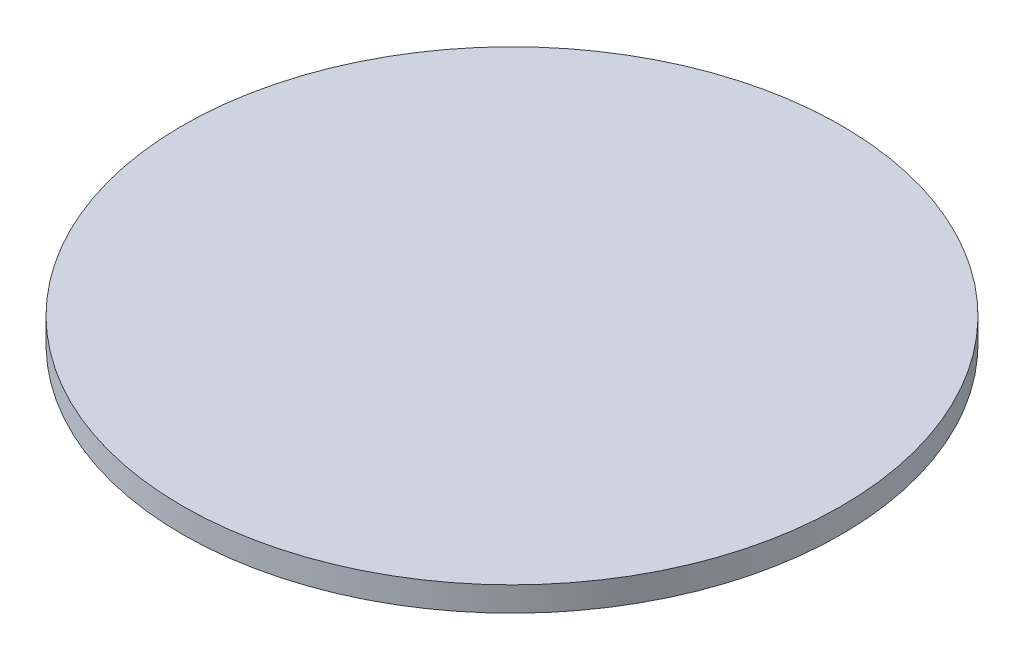
ISO-10303-21;
HEADER;
FILE_DESCRIPTION(('STEP AP214'),'2;1');
FILE_NAME('part.step','',(''),(''),'','','');
FILE_SCHEMA(('AUTOMOTIVE_DESIGN { 1 0 10303 214 1 1 1 1 }'));
ENDSEC;
DATA;
#1=APPLICATION_CONTEXT('core data for automotive mechanical design processes');
#2=APPLICATION_PROTOCOL_DEFINITION('international standard','automotive_design',2000,#1);
#3=PRODUCT_CONTEXT('',#1,'mechanical');
#4=PRODUCT('Part','Part','',(#3));
#5=PRODUCT_RELATED_PRODUCT_CATEGORY('part','',(#4));
#6=PRODUCT_DEFINITION_FORMATION('','',#4);
#7=PRODUCT_DEFINITION_CONTEXT('part definition',#1,'design');
#8=PRODUCT_DEFINITION('design','',#6,#7);
#9=PRODUCT_DEFINITION_SHAPE('','',#8);
#10=(LENGTH_UNIT() NAMED_UNIT(*) SI_UNIT(.MILLI.,.METRE.));
#11=(NAMED_UNIT(*) PLANE_ANGLE_UNIT() SI_UNIT($,.RADIAN.));
#12=(NAMED_UNIT(*) SI_UNIT($,.STERADIAN.) SOLID_ANGLE_UNIT());
#13=UNCERTAINTY_MEASURE_WITH_UNIT(LENGTH_MEASURE(1.E-05),#10,'distance_accuracy_value','');
#14=(GEOMETRIC_REPRESENTATION_CONTEXT(3) GLOBAL_UNCERTAINTY_ASSIGNED_CONTEXT((#13)) GLOBAL_UNIT_ASSIGNED_CONTEXT((#10,
#11,#12)) REPRESENTATION_CONTEXT('',''));
#15=CARTESIAN_POINT('',(0.,0.,0.));
#16=DIRECTION('',(0.,0.,1.));
#17=DIRECTION('',(1.,0.,0.));
#18=AXIS2_PLACEMENT_3D('',#15,#16,#17);
#19=CARTESIAN_POINT('',(103.,-4.90687617358795,114.707106781187));
#20=CARTESIAN_POINT('',(104.68251224703,-4.90687617358795,114.707106781187));
#21=CARTESIAN_POINT('',(108.04753674109,-4.90687617358795,114.375680796435));
#22=CARTESIAN_POINT('',(112.90109947591,-4.90687617358795,112.903368637147));
#23=CARTESIAN_POINT('',(117.374168510472,-4.90687617358795,110.512463426297));
#24=CARTESIAN_POINT('',(121.294846310303,-4.90687617358795,107.294846310303));
#25=CARTESIAN_POINT('',(124.512463426297,-4.90687617358796,103.374168510472));
#26=CARTESIAN_POINT('',(126.903368637147,-4.90687617358795,98.9010994759102));
#27=CARTESIAN_POINT('',(128.375680796435,-4.90687617358795,94.0475367410895));
#28=CARTESIAN_POINT('',(128.872819773562,-4.90687617358795,89.));
#29=CARTESIAN_POINT('',(128.375680796435,-4.90687617358796,83.9524632589106));
#30=CARTESIAN_POINT('',(126.903368637147,-4.90687617358795,79.0989005240899));
#31=CARTESIAN_POINT('',(124.512463426297,-4.90687617358795,74.6258314895279));
#32=CARTESIAN_POINT('',(121.294846310303,-4.90687617358796,70.7051536896968));
#33=CARTESIAN_POINT('',(117.374168510472,-4.90687617358795,67.4875365737027));
#34=CARTESIAN_POINT('',(112.90109947591,-4.90687617358795,65.0966313628527));
#35=CARTESIAN_POINT('',(108.04753674109,-4.90687617358796,63.6243192035646));
#36=CARTESIAN_POINT('',(103.,-4.90687617358795,63.1271802264379));
#37=CARTESIAN_POINT('',(97.9524632589106,-4.90687617358795,63.6243192035646));
#38=CARTESIAN_POINT('',(93.09890052409,-4.90687617358795,65.0966313628526));
#39=CARTESIAN_POINT('',(88.625831489528,-4.90687617358795,67.4875365737027));
#40=CARTESIAN_POINT('',(84.7051536896969,-4.90687617358796,70.7051536896968));
#41=CARTESIAN_POINT('',(81.4875365737028,-4.90687617358795,74.6258314895279));
#42=CARTESIAN_POINT('',(79.0966313628527,-4.90687617358795,79.0989005240899));
#43=CARTESIAN_POINT('',(77.6243192035647,-4.90687617358795,83.9524632589105));
#44=CARTESIAN_POINT('',(77.1271802264379,-4.90687617358796,89.));
#45=CARTESIAN_POINT('',(77.6243192035647,-4.90687617358795,94.0475367410896));
#46=CARTESIAN_POINT('',(79.0966313628527,-4.90687617358795,98.9010994759101));
#47=CARTESIAN_POINT('',(81.4875365737027,-4.90687617358795,103.374168510472));
#48=CARTESIAN_POINT('',(84.7051536896969,-4.90687617358796,107.294846310303));
#49=CARTESIAN_POINT('',(88.625831489528,-4.90687617358795,110.512463426297));
#50=CARTESIAN_POINT('',(93.09890052409,-4.90687617358795,112.903368637147));
#51=CARTESIAN_POINT('',(97.9524632589106,-4.90687617358795,114.375680796435));
#52=CARTESIAN_POINT('',(101.31748775297,-4.90687617358795,114.707106781187));
#53=CARTESIAN_POINT('',(103.,-4.90687617358795,114.707106781187));
#54=B_SPLINE_CURVE_WITH_KNOTS('',3,(#19,#20,#21,#22,#23,#24,#25,#26,#27,#28,#29,#30,#31,#32,#33,
#34,#35,#36,#37,#38,#39,#40,#41,#42,#43,#44,#45,#46,#47,#48,#49,#50,#51,#52,#53),.UNSPECIFIED.,
.T.,.F.,(4,1,1,1,1,1,1,1,1,1,1,1,1,1,1,1,1,1,1,1,1,1,1,1,1,1,1,1,1,1,1,1,4),(0.,0.03125,
0.0625000000000001,0.09375,0.125,0.15625,0.1875,0.21875,0.25,0.28125,0.3125,0.34375,0.375,
0.40625,0.4375,0.46875,0.5,0.53125,0.5625,0.59375,0.625,0.65625,0.6875,0.71875,0.75,0.78125,
0.8125,0.84375,0.875,0.90625,0.9375,0.96875,1.),.UNSPECIFIED.);
#55=DIRECTION('',(0.,1.,0.));
#56=VECTOR('',#55,1.);
#57=SURFACE_OF_LINEAR_EXTRUSION('',#54,#56);
#58=CARTESIAN_POINT('',(103.,-4.90687617358795,114.707106781187));
#59=CARTESIAN_POINT('',(104.68251224703,-4.90687617358795,114.707106781187));
#60=CARTESIAN_POINT('',(108.04753674109,-4.90687617358796,114.375680796435));
#61=CARTESIAN_POINT('',(112.90109947591,-4.90687617358796,112.903368637147));
#62=CARTESIAN_POINT('',(117.374168510472,-4.90687617358796,110.512463426297));
#63=CARTESIAN_POINT('',(121.294846310303,-4.90687617358796,107.294846310303));
#64=CARTESIAN_POINT('',(124.512463426297,-4.90687617358796,103.374168510472));
#65=CARTESIAN_POINT('',(126.903368637147,-4.90687617358795,98.9010994759102));
#66=CARTESIAN_POINT('',(128.375680796435,-4.90687617358795,94.0475367410895));
#67=CARTESIAN_POINT('',(128.872819773562,-4.90687617358795,89.));
#68=CARTESIAN_POINT('',(128.375680796435,-4.90687617358796,83.9524632589106));
#69=CARTESIAN_POINT('',(126.903368637147,-4.90687617358796,79.0989005240899));
#70=CARTESIAN_POINT('',(124.512463426297,-4.90687617358796,74.6258314895279));
#71=CARTESIAN_POINT('',(121.294846310303,-4.90687617358796,70.7051536896968));
#72=CARTESIAN_POINT('',(117.374168510472,-4.90687617358796,67.4875365737027));
#73=CARTESIAN_POINT('',(112.90109947591,-4.90687617358795,65.0966313628527));
#74=CARTESIAN_POINT('',(108.04753674109,-4.90687617358796,63.6243192035646));
#75=CARTESIAN_POINT('',(103.,-4.90687617358796,63.1271802264379));
#76=CARTESIAN_POINT('',(97.9524632589106,-4.90687617358795,63.6243192035646));
#77=CARTESIAN_POINT('',(93.09890052409,-4.90687617358795,65.0966313628526));
#78=CARTESIAN_POINT('',(88.625831489528,-4.90687617358796,67.4875365737027));
#79=CARTESIAN_POINT('',(84.7051536896969,-4.90687617358796,70.7051536896968));
#80=CARTESIAN_POINT('',(81.4875365737028,-4.90687617358795,74.6258314895279));
#81=CARTESIAN_POINT('',(79.0966313628527,-4.90687617358796,79.0989005240899));
#82=CARTESIAN_POINT('',(77.6243192035647,-4.90687617358795,83.9524632589105));
#83=CARTESIAN_POINT('',(77.1271802264379,-4.90687617358796,89.));
#84=CARTESIAN_POINT('',(77.6243192035647,-4.90687617358796,94.0475367410896));
#85=CARTESIAN_POINT('',(79.0966313628527,-4.90687617358795,98.9010994759101));
#86=CARTESIAN_POINT('',(81.4875365737027,-4.90687617358796,103.374168510472));
#87=CARTESIAN_POINT('',(84.7051536896969,-4.90687617358796,107.294846310303));
#88=CARTESIAN_POINT('',(88.625831489528,-4.90687617358795,110.512463426297));
#89=CARTESIAN_POINT('',(93.09890052409,-4.90687617358796,112.903368637147));
#90=CARTESIAN_POINT('',(97.9524632589106,-4.90687617358796,114.375680796435));
#91=CARTESIAN_POINT('',(101.31748775297,-4.90687617358795,114.707106781187));
#92=CARTESIAN_POINT('',(103.,-4.90687617358795,114.707106781187));
#93=B_SPLINE_CURVE_WITH_KNOTS('',3,(#58,#59,#60,#61,#62,#63,#64,#65,#66,#67,#68,#69,#70,#71,#72,
#73,#74,#75,#76,#77,#78,#79,#80,#81,#82,#83,#84,#85,#86,#87,#88,#89,#90,#91,#92),.UNSPECIFIED.,
.T.,.F.,(4,1,1,1,1,1,1,1,1,1,1,1,1,1,1,1,1,1,1,1,1,1,1,1,1,1,1,1,1,1,1,1,4),(0.,0.03125,
0.0625000000000001,0.09375,0.125,0.15625,0.1875,0.21875,0.25,0.28125,0.3125,0.34375,0.375,
0.40625,0.4375,0.46875,0.5,0.53125,0.5625,0.59375,0.625,0.65625,0.6875,0.71875,0.75,0.78125,
0.8125,0.84375,0.875,0.90625,0.9375,0.96875,1.),.UNSPECIFIED.);
#94=CARTESIAN_POINT('',(103.,-4.90687617358795,114.707106781187));
#95=VERTEX_POINT('',#94);
#96=EDGE_CURVE('E9',#95,#95,#93,.T.);
#97=ORIENTED_EDGE('',*,*,#96,.T.);
#98=EDGE_LOOP('',(#97));
#99=FACE_BOUND('',#98,.T.);
#100=CARTESIAN_POINT('',(103.,-2.98931512157521,114.707106781187));
#101=CARTESIAN_POINT('',(102.579369355434,-2.98931512157521,114.707106693939));
#102=CARTESIAN_POINT('',(102.158741772165,-2.98931512157521,114.696749595474));
#103=CARTESIAN_POINT('',(101.318496875122,-2.98931512157521,114.655420938262));
#104=CARTESIAN_POINT('',(100.898879569222,-2.98931512157521,114.624449219384));
#105=CARTESIAN_POINT('',(100.061665939949,-2.98931512157521,114.541990886596));
#106=CARTESIAN_POINT('',(99.6440696165763,-2.98931512157521,114.490504272685));
#107=CARTESIAN_POINT('',(98.8119060984851,-2.98931512157521,114.367115028231));
#108=CARTESIAN_POINT('',(98.3973388802626,-2.98931512157521,114.295212556279));
#109=CARTESIAN_POINT('',(97.5722456396482,-2.98931512157521,114.131091309205));
#110=CARTESIAN_POINT('',(97.1617196172563,-2.98931512157521,114.038872534082));
#111=CARTESIAN_POINT('',(96.3456816963751,-2.98931512157521,113.834414117491));
#112=CARTESIAN_POINT('',(95.9401698368598,-2.98931512157521,113.722174320509));
#113=CARTESIAN_POINT('',(95.1351301005794,-2.98931512157521,113.477968186669));
#114=CARTESIAN_POINT('',(94.7356022238144,-2.98931512157521,113.34600184981));
#115=CARTESIAN_POINT('',(93.9435004761241,-2.98931512157521,113.062636429833));
#116=CARTESIAN_POINT('',(93.5509265512054,-2.98931512157521,112.911237497673));
#117=CARTESIAN_POINT('',(92.773705730394,-2.98931512157521,112.589302092768));
#118=CARTESIAN_POINT('',(92.3890588345014,-2.98931512157521,112.418765620024));
#119=CARTESIAN_POINT('',(91.6285887070654,-2.98931512157521,112.059034712628));
#120=CARTESIAN_POINT('',(91.2527655440864,-2.98931512157521,111.869840133053));
#121=CARTESIAN_POINT('',(90.510836675156,-2.98931512157521,111.473270890529));
#122=CARTESIAN_POINT('',(90.1447309692046,-2.98931512157521,111.265896227581));
#123=CARTESIAN_POINT('',(89.4231310851812,-2.98931512157521,110.83344420958));
#124=CARTESIAN_POINT('',(89.0676368247028,-2.98931512157521,110.608366992052));
#125=CARTESIAN_POINT('',(88.3681565659301,-2.98931512157521,110.140989225494));
#126=CARTESIAN_POINT('',(88.0241705676357,-2.98931512157521,109.898688676465));
#127=CARTESIAN_POINT('',(87.3484926789989,-2.98931512157521,109.397509535533));
#128=CARTESIAN_POINT('',(87.0168008841765,-2.98931512157521,109.138630814869));
#129=CARTESIAN_POINT('',(86.3664947916554,-2.98931512157521,108.60493839719));
#130=CARTESIAN_POINT('',(86.0478804939568,-2.98931512157521,108.330124700176));
#131=CARTESIAN_POINT('',(85.4245131528125,-2.98931512157521,107.765204972699));
#132=CARTESIAN_POINT('',(85.1197600017141,-2.98931512157521,107.475099061041));
#133=CARTESIAN_POINT('',(84.5249009389586,-2.98931512157521,106.880239998286));
#134=CARTESIAN_POINT('',(84.2347950273014,-2.98931512157521,106.575486847188));
#135=CARTESIAN_POINT('',(83.6698752998245,-2.98931512157521,105.952119506043));
#136=CARTESIAN_POINT('',(83.3950616028096,-2.98931512157521,105.633505208345));
#137=CARTESIAN_POINT('',(82.8613691851309,-2.98931512157521,104.983199115824));
#138=CARTESIAN_POINT('',(82.6024904644672,-2.98931512157521,104.651507321001));
#139=CARTESIAN_POINT('',(82.1013113235354,-2.98931512157521,103.975829432364));
#140=CARTESIAN_POINT('',(81.8590107745057,-2.98931512157521,103.63184343407));
#141=CARTESIAN_POINT('',(81.3916330079478,-2.98931512157521,102.932363175297));
#142=CARTESIAN_POINT('',(81.1665557904197,-2.98931512157521,102.57686891482));
#143=CARTESIAN_POINT('',(80.7341037724191,-2.98931512157521,101.855269030795));
#144=CARTESIAN_POINT('',(80.5267291094706,-2.98931512157521,101.489163324841));
#145=CARTESIAN_POINT('',(80.1301598669476,-2.98931512157521,100.747234455917));
#146=CARTESIAN_POINT('',(79.9409652873729,-2.98931512157521,100.371411292947));
#147=CARTESIAN_POINT('',(79.5812343799753,-2.98931512157521,99.6109411654861));
#148=CARTESIAN_POINT('',(79.4106979072297,-2.98931512157521,99.2262942695591));
#149=CARTESIAN_POINT('',(79.0887625023298,-2.98931512157521,98.4490734488416));
#150=CARTESIAN_POINT('',(78.9373635701755,-2.98931512157521,98.0564995240512));
#151=CARTESIAN_POINT('',(78.6539981501812,-2.98931512157521,97.2643977760104));
#152=CARTESIAN_POINT('',(78.5220318132992,-2.98931512157521,96.8648698987665));
#153=CARTESIAN_POINT('',(78.2778256795233,-2.98931512157521,96.0598301637945));
#154=CARTESIAN_POINT('',(78.1655858826293,-2.98931512157521,95.6543183060663));
#155=CARTESIAN_POINT('',(77.9611274657977,-2.98931512157521,94.8382803803026));
#156=CARTESIAN_POINT('',(77.8689086903458,-2.98931512157521,94.4277543512412));
#157=CARTESIAN_POINT('',(77.7047874441707,-2.98931512157521,93.6026611288483));
#158=CARTESIAN_POINT('',(77.6328849734476,-2.98931512157521,93.1880939355168));
#159=CARTESIAN_POINT('',(77.5094957256366,-2.98931512157521,92.3559303494217));
#160=CARTESIAN_POINT('',(77.45800910714,-2.98931512157521,91.9383339331527));
#161=CARTESIAN_POINT('',(77.3755507868799,-2.98931512157521,91.1011205576757));
#162=CARTESIAN_POINT('',(77.3445790851164,-2.98931512157521,90.6815035984678));
#163=CARTESIAN_POINT('',(77.303250381148,-2.98931512157521,89.8412577542494));
#164=CARTESIAN_POINT('',(77.2928932188135,-2.98931512157521,89.4206288771247));
#165=CARTESIAN_POINT('',(77.2928932188135,-2.98931512157521,88.5793711228753));
#166=CARTESIAN_POINT('',(77.303250381148,-2.98931512157521,88.1587422457506));
#167=CARTESIAN_POINT('',(77.3445790851164,-2.98931512157521,87.3184964015322));
#168=CARTESIAN_POINT('',(77.3755507868799,-2.98931512157521,86.8988794423244));
#169=CARTESIAN_POINT('',(77.45800910714,-2.98931512157521,86.0616660668474));
#170=CARTESIAN_POINT('',(77.5094957256366,-2.98931512157521,85.6440696505783));
#171=CARTESIAN_POINT('',(77.6328849734475,-2.98931512157521,84.8119060644832));
#172=CARTESIAN_POINT('',(77.7047874441707,-2.98931512157521,84.3973388711518));
#173=CARTESIAN_POINT('',(77.8689086903458,-2.98931512157521,83.5722456487589));
#174=CARTESIAN_POINT('',(77.9611274657977,-2.98931512157521,83.1617196196974));
#175=CARTESIAN_POINT('',(78.1655858826293,-2.98931512157521,82.3456816939338));
#176=CARTESIAN_POINT('',(78.2778256795233,-2.98931512157521,81.9401698362056));
#177=CARTESIAN_POINT('',(78.5220318132992,-2.98931512157521,81.1351301012335));
#178=CARTESIAN_POINT('',(78.6539981501811,-2.98931512157521,80.7356022239896));
#179=CARTESIAN_POINT('',(78.9373635701755,-2.98931512157521,79.9435004759488));
#180=CARTESIAN_POINT('',(79.0887625023298,-2.98931512157521,79.5509265511584));
#181=CARTESIAN_POINT('',(79.4106979072297,-2.98931512157521,78.7737057304409));
#182=CARTESIAN_POINT('',(79.5812343799753,-2.98931512157521,78.3890588345139));
#183=CARTESIAN_POINT('',(79.9409652873729,-2.98931512157521,77.6285887070527));
#184=CARTESIAN_POINT('',(80.1301598669476,-2.98931512157521,77.252765544083));
#185=CARTESIAN_POINT('',(80.5267291094706,-2.98931512157521,76.5108366751594));
#186=CARTESIAN_POINT('',(80.734103772419,-2.98931512157521,76.1447309692054));
#187=CARTESIAN_POINT('',(81.1665557904196,-2.98931512157521,75.4231310851802));
#188=CARTESIAN_POINT('',(81.3916330079478,-2.98931512157521,75.0676368247025));
#189=CARTESIAN_POINT('',(81.8590107745057,-2.98931512157521,74.3681565659303));
#190=CARTESIAN_POINT('',(82.1013113235354,-2.98931512157521,74.0241705676357));
#191=CARTESIAN_POINT('',(82.6024904644672,-2.98931512157521,73.3484926789988));
#192=CARTESIAN_POINT('',(82.8613691851309,-2.98931512157521,73.0168008841764));
#193=CARTESIAN_POINT('',(83.3950616028096,-2.98931512157521,72.3664947916554));
#194=CARTESIAN_POINT('',(83.6698752998245,-2.98931512157521,72.0478804939567));
#195=CARTESIAN_POINT('',(84.2347950273014,-2.98931512157521,71.4245131528124));
#196=CARTESIAN_POINT('',(84.5249009389586,-2.98931512157521,71.1197600017141));
#197=CARTESIAN_POINT('',(85.1197600017141,-2.98931512157521,70.5249009389586));
#198=CARTESIAN_POINT('',(85.4245131528124,-2.98931512157521,70.2347950273013));
#199=CARTESIAN_POINT('',(86.0478804939568,-2.98931512157521,69.6698752998244));
#200=CARTESIAN_POINT('',(86.3664947916554,-2.98931512157521,69.3950616028095));
#201=CARTESIAN_POINT('',(87.0168008841764,-2.98931512157521,68.8613691851309));
#202=CARTESIAN_POINT('',(87.3484926789988,-2.98931512157521,68.6024904644671));
#203=CARTESIAN_POINT('',(88.0241705676357,-2.98931512157521,68.1013113235354));
#204=CARTESIAN_POINT('',(88.3681565659303,-2.98931512157521,67.8590107745056));
#205=CARTESIAN_POINT('',(89.0676368247026,-2.98931512157521,67.3916330079477));
#206=CARTESIAN_POINT('',(89.4231310851803,-2.98931512157521,67.1665557904196));
#207=CARTESIAN_POINT('',(90.1447309692055,-2.98931512157521,66.734103772419));
#208=CARTESIAN_POINT('',(90.5108366751594,-2.98931512157521,66.5267291094706));
#209=CARTESIAN_POINT('',(91.2527655440831,-2.98931512157521,66.1301598669475));
#210=CARTESIAN_POINT('',(91.6285887070528,-2.98931512157521,65.9409652873729));
#211=CARTESIAN_POINT('',(92.389058834514,-2.98931512157521,65.5812343799752));
#212=CARTESIAN_POINT('',(92.773705730441,-2.98931512157521,65.4106979072296));
#213=CARTESIAN_POINT('',(93.5509265511584,-2.98931512157521,65.0887625023297));
#214=CARTESIAN_POINT('',(93.9435004759489,-2.98931512157521,64.9373635701754));
#215=CARTESIAN_POINT('',(94.7356022239897,-2.98931512157521,64.6539981501811));
#216=CARTESIAN_POINT('',(95.1351301012335,-2.98931512157521,64.5220318132992));
#217=CARTESIAN_POINT('',(95.9401698362056,-2.98931512157521,64.2778256795233));
#218=CARTESIAN_POINT('',(96.3456816939338,-2.98931512157521,64.1655858826292));
#219=CARTESIAN_POINT('',(97.1617196196975,-2.98931512157521,63.9611274657976));
#220=CARTESIAN_POINT('',(97.572245648759,-2.98931512157521,63.8689086903457));
#221=CARTESIAN_POINT('',(98.3973388711519,-2.98931512157521,63.7047874441706));
#222=CARTESIAN_POINT('',(98.8119060644833,-2.98931512157521,63.6328849734474));
#223=CARTESIAN_POINT('',(99.6440696505784,-2.98931512157521,63.5094957256365));
#224=CARTESIAN_POINT('',(100.061666066847,-2.98931512157521,63.45800910714));
#225=CARTESIAN_POINT('',(100.898879442324,-2.98931512157521,63.3755507868799));
#226=CARTESIAN_POINT('',(101.318496401532,-2.98931512157521,63.3445790851163));
#227=CARTESIAN_POINT('',(102.158742245751,-2.98931512157521,63.3032503811479));
#228=CARTESIAN_POINT('',(102.579371122875,-2.98931512157521,63.2928932188135));
#229=CARTESIAN_POINT('',(103.420628877125,-2.98931512157521,63.2928932188135));
#230=CARTESIAN_POINT('',(103.841257754249,-2.98931512157522,63.3032503811479));
#231=CARTESIAN_POINT('',(104.681503598468,-2.98931512157522,63.3445790851163));
#232=CARTESIAN_POINT('',(105.101120557676,-2.98931512157521,63.3755507868799));
#233=CARTESIAN_POINT('',(105.938333933153,-2.98931512157521,63.45800910714));
#234=CARTESIAN_POINT('',(106.355930349422,-2.98931512157521,63.5094957256365));
#235=CARTESIAN_POINT('',(107.188093935517,-2.98931512157522,63.6328849734474));
#236=CARTESIAN_POINT('',(107.602661128848,-2.98931512157522,63.7047874441706));
#237=CARTESIAN_POINT('',(108.427754351241,-2.98931512157522,63.8689086903457));
#238=CARTESIAN_POINT('',(108.838280380303,-2.98931512157522,63.9611274657976));
#239=CARTESIAN_POINT('',(109.654318306066,-2.98931512157521,64.1655858826292));
#240=CARTESIAN_POINT('',(110.059830163795,-2.98931512157521,64.2778256795233));
#241=CARTESIAN_POINT('',(110.864869898767,-2.98931512157521,64.5220318132992));
#242=CARTESIAN_POINT('',(111.26439777601,-2.98931512157521,64.6539981501811));
#243=CARTESIAN_POINT('',(112.056499524051,-2.98931512157521,64.9373635701754));
#244=CARTESIAN_POINT('',(112.449073448842,-2.98931512157521,65.0887625023297));
#245=CARTESIAN_POINT('',(113.226294269559,-2.98931512157521,65.4106979072296));
#246=CARTESIAN_POINT('',(113.610941165486,-2.98931512157521,65.5812343799753));
#247=CARTESIAN_POINT('',(114.371411292947,-2.98931512157521,65.9409652873729));
#248=CARTESIAN_POINT('',(114.747234455917,-2.98931512157521,66.1301598669475));
#249=CARTESIAN_POINT('',(115.489163324841,-2.98931512157521,66.5267291094706));
#250=CARTESIAN_POINT('',(115.855269030795,-2.98931512157521,66.734103772419));
#251=CARTESIAN_POINT('',(116.57686891482,-2.98931512157521,67.1665557904196));
#252=CARTESIAN_POINT('',(116.932363175298,-2.98931512157521,67.3916330079478));
#253=CARTESIAN_POINT('',(117.63184343407,-2.98931512157521,67.8590107745057));
#254=CARTESIAN_POINT('',(117.975829432364,-2.98931512157521,68.1013113235354));
#255=CARTESIAN_POINT('',(118.651507321001,-2.98931512157521,68.6024904644671));
#256=CARTESIAN_POINT('',(118.983199115824,-2.98931512157521,68.8613691851309));
#257=CARTESIAN_POINT('',(119.633505208345,-2.98931512157521,69.3950616028095));
#258=CARTESIAN_POINT('',(119.952119506043,-2.98931512157521,69.6698752998244));
#259=CARTESIAN_POINT('',(120.575486847188,-2.98931512157521,70.2347950273013));
#260=CARTESIAN_POINT('',(120.880239998286,-2.98931512157521,70.5249009389586));
#261=CARTESIAN_POINT('',(121.475099061042,-2.98931512157521,71.1197600017141));
#262=CARTESIAN_POINT('',(121.765204972699,-2.98931512157521,71.4245131528124));
#263=CARTESIAN_POINT('',(122.330124700176,-2.98931512157521,72.0478804939567));
#264=CARTESIAN_POINT('',(122.604938397191,-2.98931512157521,72.3664947916554));
#265=CARTESIAN_POINT('',(123.138630814869,-2.98931512157521,73.0168008841764));
#266=CARTESIAN_POINT('',(123.397509535533,-2.98931512157521,73.3484926789988));
#267=CARTESIAN_POINT('',(123.898688676465,-2.98931512157521,74.0241705676357));
#268=CARTESIAN_POINT('',(124.140989225494,-2.98931512157521,74.3681565659303));
#269=CARTESIAN_POINT('',(124.608366992052,-2.98931512157521,75.0676368247025));
#270=CARTESIAN_POINT('',(124.833444209581,-2.98931512157521,75.4231310851802));
#271=CARTESIAN_POINT('',(125.265896227581,-2.98931512157521,76.1447309692054));
#272=CARTESIAN_POINT('',(125.47327089053,-2.98931512157521,76.5108366751594));
#273=CARTESIAN_POINT('',(125.869840133053,-2.98931512157521,77.252765544083));
#274=CARTESIAN_POINT('',(126.059034712627,-2.98931512157521,77.6285887070528));
#275=CARTESIAN_POINT('',(126.418765620025,-2.98931512157521,78.389058834514));
#276=CARTESIAN_POINT('',(126.589302092771,-2.98931512157521,78.773705730441));
#277=CARTESIAN_POINT('',(126.91123749767,-2.98931512157521,79.5509265511584));
#278=CARTESIAN_POINT('',(127.062636429825,-2.98931512157521,79.9435004759488));
#279=CARTESIAN_POINT('',(127.346001849819,-2.98931512157521,80.7356022239897));
#280=CARTESIAN_POINT('',(127.477968186701,-2.98931512157521,81.1351301012335));
#281=CARTESIAN_POINT('',(127.722174320477,-2.98931512157521,81.9401698362056));
#282=CARTESIAN_POINT('',(127.834414117371,-2.98931512157521,82.3456816939338));
#283=CARTESIAN_POINT('',(128.038872534202,-2.98931512157521,83.1617196196975));
#284=CARTESIAN_POINT('',(128.131091309654,-2.98931512157521,83.5722456487589));
#285=CARTESIAN_POINT('',(128.295212555829,-2.98931512157521,84.3973388711518));
#286=CARTESIAN_POINT('',(128.367115026553,-2.98931512157521,84.8119060644833));
#287=CARTESIAN_POINT('',(128.490504274364,-2.98931512157521,85.6440696505783));
#288=CARTESIAN_POINT('',(128.54199089286,-2.98931512157521,86.0616660668474));
#289=CARTESIAN_POINT('',(128.62444921312,-2.98931512157521,86.8988794423244));
#290=CARTESIAN_POINT('',(128.655420914884,-2.98931512157521,87.3184964015322));
#291=CARTESIAN_POINT('',(128.696749618852,-2.98931512157521,88.1587422457506));
#292=CARTESIAN_POINT('',(128.707106781187,-2.98931512157521,88.5793711228753));
#293=CARTESIAN_POINT('',(128.707106781187,-2.98931512157521,89.4206288771247));
#294=CARTESIAN_POINT('',(128.696749618852,-2.98931512157521,89.8412577542494));
#295=CARTESIAN_POINT('',(128.655420914884,-2.98931512157521,90.6815035984678));
#296=CARTESIAN_POINT('',(128.62444921312,-2.98931512157521,91.1011205576757));
#297=CARTESIAN_POINT('',(128.54199089286,-2.98931512157521,91.9383339331526));
#298=CARTESIAN_POINT('',(128.490504274364,-2.98931512157521,92.3559303494217));
#299=CARTESIAN_POINT('',(128.367115026553,-2.98931512157521,93.1880939355168));
#300=CARTESIAN_POINT('',(128.295212555829,-2.98931512157521,93.6026611288482));
#301=CARTESIAN_POINT('',(128.131091309654,-2.98931512157521,94.4277543512411));
#302=CARTESIAN_POINT('',(128.038872534202,-2.98931512157521,94.8382803803026));
#303=CARTESIAN_POINT('',(127.834414117371,-2.98931512157521,95.6543183060663));
#304=CARTESIAN_POINT('',(127.722174320477,-2.98931512157521,96.0598301637945));
#305=CARTESIAN_POINT('',(127.477968186701,-2.98931512157521,96.8648698987665));
#306=CARTESIAN_POINT('',(127.346001849819,-2.98931512157521,97.2643977760104));
#307=CARTESIAN_POINT('',(127.062636429825,-2.98931512157521,98.0564995240512));
#308=CARTESIAN_POINT('',(126.91123749767,-2.98931512157521,98.4490734488416));
#309=CARTESIAN_POINT('',(126.58930209277,-2.98931512157521,99.2262942695591));
#310=CARTESIAN_POINT('',(126.418765620025,-2.98931512157521,99.6109411654861));
#311=CARTESIAN_POINT('',(126.059034712627,-2.98931512157521,100.371411292947));
#312=CARTESIAN_POINT('',(125.869840133053,-2.98931512157521,100.747234455917));
#313=CARTESIAN_POINT('',(125.47327089053,-2.98931512157521,101.489163324841));
#314=CARTESIAN_POINT('',(125.265896227581,-2.98931512157521,101.855269030795));
#315=CARTESIAN_POINT('',(124.833444209581,-2.98931512157521,102.57686891482));
#316=CARTESIAN_POINT('',(124.608366992052,-2.98931512157521,102.932363175297));
#317=CARTESIAN_POINT('',(124.140989225494,-2.98931512157521,103.63184343407));
#318=CARTESIAN_POINT('',(123.898688676465,-2.98931512157521,103.975829432364));
#319=CARTESIAN_POINT('',(123.397509535533,-2.98931512157521,104.651507321001));
#320=CARTESIAN_POINT('',(123.138630814869,-2.98931512157521,104.983199115824));
#321=CARTESIAN_POINT('',(122.604938397191,-2.98931512157521,105.633505208345));
#322=CARTESIAN_POINT('',(122.330124700176,-2.98931512157521,105.952119506043));
#323=CARTESIAN_POINT('',(121.765204972699,-2.98931512157521,106.575486847188));
#324=CARTESIAN_POINT('',(121.475099061042,-2.98931512157521,106.880239998286));
#325=CARTESIAN_POINT('',(120.880239998286,-2.98931512157521,107.475099061041));
#326=CARTESIAN_POINT('',(120.575486847188,-2.98931512157521,107.765204972699));
#327=CARTESIAN_POINT('',(119.952119506043,-2.98931512157521,108.330124700176));
#328=CARTESIAN_POINT('',(119.633505208345,-2.98931512157521,108.60493839719));
#329=CARTESIAN_POINT('',(118.983199115824,-2.98931512157521,109.138630814869));
#330=CARTESIAN_POINT('',(118.651507321001,-2.98931512157521,109.397509535533));
#331=CARTESIAN_POINT('',(117.975829432364,-2.98931512157521,109.898688676465));
#332=CARTESIAN_POINT('',(117.63184343407,-2.98931512157521,110.140989225494));
#333=CARTESIAN_POINT('',(116.932363175297,-2.98931512157521,110.608366992052));
#334=CARTESIAN_POINT('',(116.576868914819,-2.98931512157521,110.83344420958));
#335=CARTESIAN_POINT('',(115.855269030796,-2.98931512157521,111.265896227581));
#336=CARTESIAN_POINT('',(115.489163324844,-2.98931512157521,111.473270890529));
#337=CARTESIAN_POINT('',(114.747234455914,-2.98931512157521,111.869840133053));
#338=CARTESIAN_POINT('',(114.371411292935,-2.98931512157521,112.059034712628));
#339=CARTESIAN_POINT('',(113.610941165499,-2.98931512157521,112.418765620024));
#340=CARTESIAN_POINT('',(113.226294269606,-2.98931512157521,112.589302092768));
#341=CARTESIAN_POINT('',(112.449073448795,-2.98931512157521,112.911237497673));
#342=CARTESIAN_POINT('',(112.056499523876,-2.98931512157521,113.062636429833));
#343=CARTESIAN_POINT('',(111.264397776186,-2.98931512157521,113.34600184981));
#344=CARTESIAN_POINT('',(110.864869899421,-2.98931512157521,113.477968186669));
#345=CARTESIAN_POINT('',(110.05983016314,-2.98931512157521,113.722174320509));
#346=CARTESIAN_POINT('',(109.654318303625,-2.98931512157521,113.834414117491));
#347=CARTESIAN_POINT('',(108.838280382744,-2.98931512157521,114.038872534082));
#348=CARTESIAN_POINT('',(108.427754360352,-2.98931512157521,114.131091309205));
#349=CARTESIAN_POINT('',(107.602661119738,-2.98931512157521,114.295212556279));
#350=CARTESIAN_POINT('',(107.188093901515,-2.98931512157521,114.367115028231));
#351=CARTESIAN_POINT('',(106.355930383424,-2.98931512157521,114.490504272685));
#352=CARTESIAN_POINT('',(105.938334060051,-2.98931512157521,114.541990886596));
#353=CARTESIAN_POINT('',(105.101120430778,-2.98931512157521,114.624449219384));
#354=CARTESIAN_POINT('',(104.681503124878,-2.98931512157521,114.655420938262));
#355=CARTESIAN_POINT('',(103.841258227836,-2.98931512157521,114.696749595474));
#356=CARTESIAN_POINT('',(103.420630644566,-2.98931512157521,114.707106693939));
#357=CARTESIAN_POINT('',(103.,-2.98931512157521,114.707106781187));
#358=B_SPLINE_CURVE_WITH_KNOTS('',3,(#100,#101,#102,#103,#104,#105,#106,#107,#108,#109,#110,
#111,#112,#113,#114,#115,#116,#117,#118,#119,#120,#121,#122,#123,#124,#125,#126,#127,#128,#129,
#130,#131,#132,#133,#134,#135,#136,#137,#138,#139,#140,#141,#142,#143,#144,#145,#146,#147,#148,
#149,#150,#151,#152,#153,#154,#155,#156,#157,#158,#159,#160,#161,#162,#163,#164,#165,#166,#167,
#168,#169,#170,#171,#172,#173,#174,#175,#176,#177,#178,#179,#180,#181,#182,#183,#184,#185,#186,
#187,#188,#189,#190,#191,#192,#193,#194,#195,#196,#197,#198,#199,#200,#201,#202,#203,#204,#205,
#206,#207,#208,#209,#210,#211,#212,#213,#214,#215,#216,#217,#218,#219,#220,#221,#222,#223,#224,
#225,#226,#227,#228,#229,#230,#231,#232,#233,#234,#235,#236,#237,#238,#239,#240,#241,#242,#243,
#244,#245,#246,#247,#248,#249,#250,#251,#252,#253,#254,#255,#256,#257,#258,#259,#260,#261,#262,
#263,#264,#265,#266,#267,#268,#269,#270,#271,#272,#273,#274,#275,#276,#277,#278,#279,#280,#281,
#282,#283,#284,#285,#286,#287,#288,#289,#290,#291,#292,#293,#294,#295,#296,#297,#298,#299,#300,
#301,#302,#303,#304,#305,#306,#307,#308,#309,#310,#311,#312,#313,#314,#315,#316,#317,#318,#319,
#320,#321,#322,#323,#324,#325,#326,#327,#328,#329,#330,#331,#332,#333,#334,#335,#336,#337,#338,
#339,#340,#341,#342,#343,#344,#345,#346,#347,#348,#349,#350,#351,#352,#353,#354,#355,#356,#357),
.UNSPECIFIED.,.F.,.F.,(4,2,2,2,2,2,2,2,2,2,2,2,2,2,2,2,2,2,2,2,2,2,2,2,2,2,2,2,2,2,2,2,2,2,2,2,
2,2,2,2,2,2,2,2,2,2,2,2,2,2,2,2,2,2,2,2,2,2,2,2,2,2,2,2,2,2,2,2,2,2,2,2,2,2,2,2,2,2,2,2,2,2,2,2,
2,2,2,2,2,2,2,2,2,2,2,2,2,2,2,2,2,2,2,2,2,2,2,2,2,2,2,2,2,2,2,2,2,2,2,2,2,2,2,2,2,2,2,2,4),(0.,
1.26176044620421,2.52353069362215,3.78530094104011,5.04706138724433,6.30882183344853,
7.57059208086647,8.83236232828444,10.0941227744886,11.3558832206928,12.6176534681108,
13.8794237155288,15.141184161733,16.4029446079372,17.6647148553551,18.9264851027731,
20.1882455489773,21.4500059951815,22.7117762425994,23.9735464900174,25.2353069362216,
26.4970673824258,27.7588376298438,29.0206078772617,30.2823683234659,31.5441287696701,
32.805899017088,34.067669264506,35.3294297107102,36.5911901569144,37.8529604043324,
39.1147306517503,40.3764910979545,41.6382515441587,42.9000217915767,44.1617920389946,
45.4235524851989,46.6853129314031,47.947083178821,49.208853426239,50.4706138724432,
51.7323743186474,52.9941445660653,54.2559148134833,55.5176752596875,56.7794357058917,
58.0412059533097,59.3029762007276,60.5647366469318,61.826497093136,63.088267340554,
64.3500375879719,65.6117980341761,66.8735584803804,68.1353287277983,69.3970989752162,
70.6588594214204,71.9206198676247,73.1823901150426,74.4441603624606,75.7059208086648,
76.967681254869,78.2294515022869,79.4912217497049,80.7529821959091,82.0147426421133,
83.2765128895313,84.5382831369492,85.8000435831535,87.0618040293577,88.3235742767756,
89.5853445241936,90.8471049703978,92.108865416602,93.3706356640199,94.6324059114379,
95.8941663576421,97.1559268038463,98.4176970512643,99.6794672986822,100.941227744886,
102.202988191091,103.464758438509,104.726528685927,105.988289132131,107.250049578335,
108.511819825753,109.773590073171,111.035350519375,112.297110965579,113.558881212997,
114.820651460415,116.082411906619,117.344172352824,118.605942600242,119.86771284766,
121.129473293864,122.391233740068,123.653003987486,124.914774234904,126.176534681108,
127.438295127312,128.70006537473,129.961835622148,131.223596068352,132.485356514557,
133.747126761974,135.008897009392,136.270657455597,137.532417901801,138.794188149219,
140.055958396637,141.317718842841,142.579479289045,143.841249536463,145.103019783881,
146.364780230085,147.626540676289,148.888310923707,150.150081171125,151.41184161733,
152.673602063534,153.935372310952,155.19714255837,156.458903004574,157.720663450778,
158.982433698196,160.244203945614,161.505964391818),.UNSPECIFIED.);
#359=CARTESIAN_POINT('',(103.,-2.98931512157521,114.707106781187));
#360=VERTEX_POINT('',#359);
#361=EDGE_CURVE('E24',#360,#360,#358,.F.);
#362=ORIENTED_EDGE('',*,*,#361,.F.);
#363=EDGE_LOOP('',(#362));
#364=FACE_BOUND('',#363,.T.);
#365=ADVANCED_FACE('F14',(#99,#364),#57,.T.);
#366=CARTESIAN_POINT('',(91.9905859982235,-4.90687617358795,115.737030383871));
#367=DIRECTION('',(0.,1.,0.));
#368=DIRECTION('',(-1.,0.,0.));
#369=AXIS2_PLACEMENT_3D('',#366,#367,#368);
#370=PLANE('',#369);
#371=ORIENTED_EDGE('',*,*,#96,.F.);
#372=EDGE_LOOP('',(#371));
#373=FACE_BOUND('',#372,.T.);
#374=ADVANCED_FACE('F62',(#373),#370,.F.);
#375=CARTESIAN_POINT('',(91.9905859982235,-2.98931512157521,115.737030383871));
#376=DIRECTION('',(0.,1.,0.));
#377=DIRECTION('',(-1.,0.,0.));
#378=AXIS2_PLACEMENT_3D('',#375,#376,#377);
#379=PLANE('',#378);
#380=ORIENTED_EDGE('',*,*,#361,.T.);
#381=EDGE_LOOP('',(#380));
#382=FACE_BOUND('',#381,.T.);
#383=ADVANCED_FACE('F31',(#382),#379,.T.);
#384=CLOSED_SHELL('',(#365,#374,#383));
#385=MANIFOLD_SOLID_BREP('B1',#384);
#386=ADVANCED_BREP_SHAPE_REPRESENTATION('',(#18,#385),#14);
#387=SHAPE_DEFINITION_REPRESENTATION(#9,#386);
ENDSEC;
END-ISO-10303-21;
